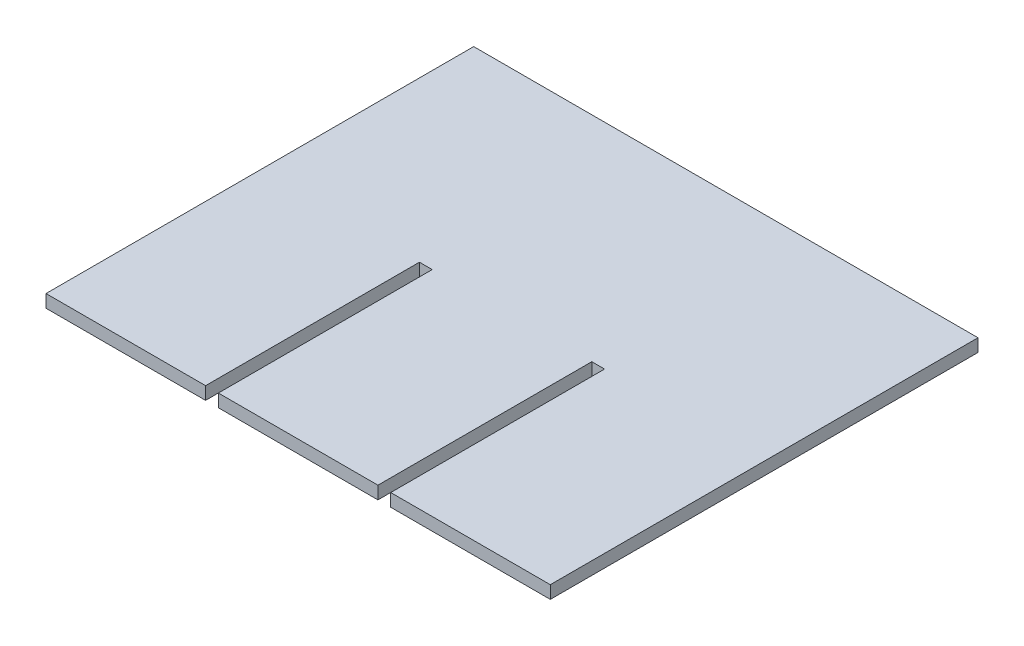
ISO-10303-21;
HEADER;
FILE_DESCRIPTION(('STEP AP214'),'2;1');
FILE_NAME('part.step','',(''),(''),'','','');
FILE_SCHEMA(('AUTOMOTIVE_DESIGN { 1 0 10303 214 1 1 1 1 }'));
ENDSEC;
DATA;
#1=APPLICATION_CONTEXT('core data for automotive mechanical design processes');
#2=APPLICATION_PROTOCOL_DEFINITION('international standard','automotive_design',2000,#1);
#3=PRODUCT_CONTEXT('',#1,'mechanical');
#4=PRODUCT('Part','Part','',(#3));
#5=PRODUCT_RELATED_PRODUCT_CATEGORY('part','',(#4));
#6=PRODUCT_DEFINITION_FORMATION('','',#4);
#7=PRODUCT_DEFINITION_CONTEXT('part definition',#1,'design');
#8=PRODUCT_DEFINITION('design','',#6,#7);
#9=PRODUCT_DEFINITION_SHAPE('','',#8);
#10=(LENGTH_UNIT() NAMED_UNIT(*) SI_UNIT(.MILLI.,.METRE.));
#11=(NAMED_UNIT(*) PLANE_ANGLE_UNIT() SI_UNIT($,.RADIAN.));
#12=(NAMED_UNIT(*) SI_UNIT($,.STERADIAN.) SOLID_ANGLE_UNIT());
#13=UNCERTAINTY_MEASURE_WITH_UNIT(LENGTH_MEASURE(1.E-05),#10,'distance_accuracy_value','');
#14=(GEOMETRIC_REPRESENTATION_CONTEXT(3) GLOBAL_UNCERTAINTY_ASSIGNED_CONTEXT((#13)) GLOBAL_UNIT_ASSIGNED_CONTEXT((#10,
#11,#12)) REPRESENTATION_CONTEXT('',''));
#15=CARTESIAN_POINT('',(0.,0.,0.));
#16=DIRECTION('',(0.,0.,1.));
#17=DIRECTION('',(1.,0.,0.));
#18=AXIS2_PLACEMENT_3D('',#15,#16,#17);
#19=CARTESIAN_POINT('',(39.5,2.,33.5));
#20=DIRECTION('',(0.,0.,-1.));
#21=DIRECTION('',(-1.,0.,0.));
#22=AXIS2_PLACEMENT_3D('',#19,#20,#21);
#23=PLANE('',#22);
#24=DIRECTION('',(0.,1.,0.));
#25=VECTOR('',#24,1.);
#26=CARTESIAN_POINT('',(-14.5,0.,33.5));
#27=LINE('',#26,#25);
#28=CARTESIAN_POINT('',(-14.5,0.,33.5));
#29=VERTEX_POINT('',#28);
#30=CARTESIAN_POINT('',(-14.5,2.,33.5));
#31=VERTEX_POINT('',#30);
#32=EDGE_CURVE('E237',#29,#31,#27,.T.);
#33=ORIENTED_EDGE('',*,*,#32,.T.);
#34=DIRECTION('',(1.,0.,0.));
#35=VECTOR('',#34,1.);
#36=CARTESIAN_POINT('',(39.5,2.,33.5));
#37=LINE('',#36,#35);
#38=CARTESIAN_POINT('',(-39.5,2.,33.5));
#39=VERTEX_POINT('',#38);
#40=EDGE_CURVE('E145',#39,#31,#37,.T.);
#41=ORIENTED_EDGE('',*,*,#40,.F.);
#42=DIRECTION('',(0.,-1.,0.));
#43=VECTOR('',#42,1.);
#44=CARTESIAN_POINT('',(-39.5,2.,33.5));
#45=LINE('',#44,#43);
#46=CARTESIAN_POINT('',(-39.5,0.,33.5));
#47=VERTEX_POINT('',#46);
#48=EDGE_CURVE('E11',#39,#47,#45,.T.);
#49=ORIENTED_EDGE('',*,*,#48,.T.);
#50=DIRECTION('',(1.,0.,0.));
#51=VECTOR('',#50,1.);
#52=CARTESIAN_POINT('',(39.5,0.,33.5));
#53=LINE('',#52,#51);
#54=EDGE_CURVE('E162',#47,#29,#53,.T.);
#55=ORIENTED_EDGE('',*,*,#54,.T.);
#56=EDGE_LOOP('',(#33,#41,#49,#55));
#57=FACE_BOUND('',#56,.T.);
#58=ADVANCED_FACE('F35',(#57),#23,.F.);
#59=DIRECTION('',(0.,1.,0.));
#60=VECTOR('',#59,1.);
#61=CARTESIAN_POINT('',(-12.5,0.,33.5));
#62=LINE('',#61,#60);
#63=CARTESIAN_POINT('',(-12.5,0.,33.5));
#64=VERTEX_POINT('',#63);
#65=CARTESIAN_POINT('',(-12.5,2.,33.5));
#66=VERTEX_POINT('',#65);
#67=EDGE_CURVE('E123',#64,#66,#62,.T.);
#68=ORIENTED_EDGE('',*,*,#67,.F.);
#69=CARTESIAN_POINT('',(12.5,0.,33.5));
#70=VERTEX_POINT('',#69);
#71=EDGE_CURVE('E58',#64,#70,#53,.T.);
#72=ORIENTED_EDGE('',*,*,#71,.T.);
#73=DIRECTION('',(0.,1.,0.));
#74=VECTOR('',#73,1.);
#75=CARTESIAN_POINT('',(12.5,0.,33.5));
#76=LINE('',#75,#74);
#77=CARTESIAN_POINT('',(12.5,2.,33.5));
#78=VERTEX_POINT('',#77);
#79=EDGE_CURVE('E144',#70,#78,#76,.T.);
#80=ORIENTED_EDGE('',*,*,#79,.T.);
#81=EDGE_CURVE('E136',#66,#78,#37,.T.);
#82=ORIENTED_EDGE('',*,*,#81,.F.);
#83=EDGE_LOOP('',(#68,#72,#80,#82));
#84=FACE_BOUND('',#83,.T.);
#85=ADVANCED_FACE('F143',(#84),#23,.F.);
#86=CARTESIAN_POINT('',(0.,2.,0.));
#87=DIRECTION('',(0.,1.,0.));
#88=DIRECTION('',(0.,0.,1.));
#89=AXIS2_PLACEMENT_3D('',#86,#87,#88);
#90=PLANE('',#89);
#91=ORIENTED_EDGE('',*,*,#40,.T.);
#92=DIRECTION('',(0.,0.,-1.));
#93=VECTOR('',#92,1.);
#94=CARTESIAN_POINT('',(-14.5,2.,33.5));
#95=LINE('',#94,#93);
#96=CARTESIAN_POINT('',(-14.5,2.,0.));
#97=VERTEX_POINT('',#96);
#98=EDGE_CURVE('E225',#31,#97,#95,.T.);
#99=ORIENTED_EDGE('',*,*,#98,.T.);
#100=DIRECTION('',(1.,0.,0.));
#101=VECTOR('',#100,1.);
#102=CARTESIAN_POINT('',(-14.5,2.,0.));
#103=LINE('',#102,#101);
#104=CARTESIAN_POINT('',(-12.5,2.,0.));
#105=VERTEX_POINT('',#104);
#106=EDGE_CURVE('E140',#97,#105,#103,.T.);
#107=ORIENTED_EDGE('',*,*,#106,.T.);
#108=DIRECTION('',(0.,0.,1.));
#109=VECTOR('',#108,1.);
#110=CARTESIAN_POINT('',(-12.5,2.,0.));
#111=LINE('',#110,#109);
#112=EDGE_CURVE('E126',#105,#66,#111,.T.);
#113=ORIENTED_EDGE('',*,*,#112,.T.);
#114=ORIENTED_EDGE('',*,*,#81,.T.);
#115=DIRECTION('',(0.,0.,1.));
#116=VECTOR('',#115,1.);
#117=CARTESIAN_POINT('',(12.5,2.,0.));
#118=LINE('',#117,#116);
#119=CARTESIAN_POINT('',(12.5,2.,0.));
#120=VERTEX_POINT('',#119);
#121=EDGE_CURVE('E224',#120,#78,#118,.T.);
#122=ORIENTED_EDGE('',*,*,#121,.F.);
#123=DIRECTION('',(-1.,0.,0.));
#124=VECTOR('',#123,1.);
#125=CARTESIAN_POINT('',(14.5,2.,0.));
#126=LINE('',#125,#124);
#127=CARTESIAN_POINT('',(14.5,2.,0.));
#128=VERTEX_POINT('',#127);
#129=EDGE_CURVE('E222',#128,#120,#126,.T.);
#130=ORIENTED_EDGE('',*,*,#129,.F.);
#131=DIRECTION('',(0.,0.,-1.));
#132=VECTOR('',#131,1.);
#133=CARTESIAN_POINT('',(14.5,2.,33.5));
#134=LINE('',#133,#132);
#135=CARTESIAN_POINT('',(14.5,2.,33.5));
#136=VERTEX_POINT('',#135);
#137=EDGE_CURVE('E200',#136,#128,#134,.T.);
#138=ORIENTED_EDGE('',*,*,#137,.F.);
#139=CARTESIAN_POINT('',(39.5,2.,33.5));
#140=VERTEX_POINT('',#139);
#141=EDGE_CURVE('E146',#136,#140,#37,.T.);
#142=ORIENTED_EDGE('',*,*,#141,.T.);
#143=DIRECTION('',(0.,0.,-1.));
#144=VECTOR('',#143,1.);
#145=CARTESIAN_POINT('',(39.5,2.,33.5));
#146=LINE('',#145,#144);
#147=CARTESIAN_POINT('',(39.5,2.,-33.5));
#148=VERTEX_POINT('',#147);
#149=EDGE_CURVE('E148',#140,#148,#146,.T.);
#150=ORIENTED_EDGE('',*,*,#149,.T.);
#151=DIRECTION('',(-1.,0.,0.));
#152=VECTOR('',#151,1.);
#153=CARTESIAN_POINT('',(39.5,2.,-33.5));
#154=LINE('',#153,#152);
#155=CARTESIAN_POINT('',(-39.5,2.,-33.5));
#156=VERTEX_POINT('',#155);
#157=EDGE_CURVE('E154',#148,#156,#154,.T.);
#158=ORIENTED_EDGE('',*,*,#157,.T.);
#159=DIRECTION('',(0.,0.,1.));
#160=VECTOR('',#159,1.);
#161=CARTESIAN_POINT('',(-39.5,2.,33.5));
#162=LINE('',#161,#160);
#163=EDGE_CURVE('E149',#156,#39,#162,.T.);
#164=ORIENTED_EDGE('',*,*,#163,.T.);
#165=EDGE_LOOP('',(#91,#99,#107,#113,#114,#122,#130,#138,#142,#150,#158,#164));
#166=FACE_BOUND('',#165,.T.);
#167=ADVANCED_FACE('F134',(#166),#90,.T.);
#168=CARTESIAN_POINT('',(0.,0.,0.));
#169=DIRECTION('',(0.,1.,0.));
#170=DIRECTION('',(0.,0.,1.));
#171=AXIS2_PLACEMENT_3D('',#168,#169,#170);
#172=PLANE('',#171);
#173=DIRECTION('',(0.,0.,-1.));
#174=VECTOR('',#173,1.);
#175=CARTESIAN_POINT('',(-14.5,0.,33.5));
#176=LINE('',#175,#174);
#177=CARTESIAN_POINT('',(-14.5,0.,0.));
#178=VERTEX_POINT('',#177);
#179=EDGE_CURVE('E141',#29,#178,#176,.T.);
#180=ORIENTED_EDGE('',*,*,#179,.F.);
#181=ORIENTED_EDGE('',*,*,#54,.F.);
#182=DIRECTION('',(0.,0.,1.));
#183=VECTOR('',#182,1.);
#184=CARTESIAN_POINT('',(-39.5,0.,33.5));
#185=LINE('',#184,#183);
#186=CARTESIAN_POINT('',(-39.5,0.,-33.5));
#187=VERTEX_POINT('',#186);
#188=EDGE_CURVE('E157',#187,#47,#185,.T.);
#189=ORIENTED_EDGE('',*,*,#188,.F.);
#190=DIRECTION('',(-1.,0.,0.));
#191=VECTOR('',#190,1.);
#192=CARTESIAN_POINT('',(39.5,0.,-33.5));
#193=LINE('',#192,#191);
#194=CARTESIAN_POINT('',(39.5,0.,-33.5));
#195=VERTEX_POINT('',#194);
#196=EDGE_CURVE('E167',#195,#187,#193,.T.);
#197=ORIENTED_EDGE('',*,*,#196,.F.);
#198=DIRECTION('',(0.,0.,-1.));
#199=VECTOR('',#198,1.);
#200=CARTESIAN_POINT('',(39.5,0.,33.5));
#201=LINE('',#200,#199);
#202=CARTESIAN_POINT('',(39.5,0.,33.5));
#203=VERTEX_POINT('',#202);
#204=EDGE_CURVE('E165',#203,#195,#201,.T.);
#205=ORIENTED_EDGE('',*,*,#204,.F.);
#206=CARTESIAN_POINT('',(14.5,0.,33.5));
#207=VERTEX_POINT('',#206);
#208=EDGE_CURVE('E160',#207,#203,#53,.T.);
#209=ORIENTED_EDGE('',*,*,#208,.F.);
#210=DIRECTION('',(0.,0.,-1.));
#211=VECTOR('',#210,1.);
#212=CARTESIAN_POINT('',(14.5,0.,33.5));
#213=LINE('',#212,#211);
#214=CARTESIAN_POINT('',(14.5,0.,0.));
#215=VERTEX_POINT('',#214);
#216=EDGE_CURVE('E210',#207,#215,#213,.T.);
#217=ORIENTED_EDGE('',*,*,#216,.T.);
#218=DIRECTION('',(-1.,0.,0.));
#219=VECTOR('',#218,1.);
#220=CARTESIAN_POINT('',(14.5,0.,0.));
#221=LINE('',#220,#219);
#222=CARTESIAN_POINT('',(12.5,0.,0.));
#223=VERTEX_POINT('',#222);
#224=EDGE_CURVE('E218',#215,#223,#221,.T.);
#225=ORIENTED_EDGE('',*,*,#224,.T.);
#226=DIRECTION('',(0.,0.,1.));
#227=VECTOR('',#226,1.);
#228=CARTESIAN_POINT('',(12.5,0.,0.));
#229=LINE('',#228,#227);
#230=EDGE_CURVE('E214',#223,#70,#229,.T.);
#231=ORIENTED_EDGE('',*,*,#230,.T.);
#232=ORIENTED_EDGE('',*,*,#71,.F.);
#233=DIRECTION('',(0.,0.,1.));
#234=VECTOR('',#233,1.);
#235=CARTESIAN_POINT('',(-12.5,0.,0.));
#236=LINE('',#235,#234);
#237=CARTESIAN_POINT('',(-12.5,0.,0.));
#238=VERTEX_POINT('',#237);
#239=EDGE_CURVE('E129',#238,#64,#236,.T.);
#240=ORIENTED_EDGE('',*,*,#239,.F.);
#241=DIRECTION('',(1.,0.,0.));
#242=VECTOR('',#241,1.);
#243=CARTESIAN_POINT('',(-14.5,0.,0.));
#244=LINE('',#243,#242);
#245=EDGE_CURVE('E229',#178,#238,#244,.T.);
#246=ORIENTED_EDGE('',*,*,#245,.F.);
#247=EDGE_LOOP('',(#180,#181,#189,#197,#205,#209,#217,#225,#231,#232,#240,#246));
#248=FACE_BOUND('',#247,.T.);
#249=ADVANCED_FACE('F186',(#248),#172,.F.);
#250=ORIENTED_EDGE('',*,*,#141,.F.);
#251=DIRECTION('',(0.,1.,0.));
#252=VECTOR('',#251,1.);
#253=CARTESIAN_POINT('',(14.5,0.,33.5));
#254=LINE('',#253,#252);
#255=EDGE_CURVE('E203',#207,#136,#254,.T.);
#256=ORIENTED_EDGE('',*,*,#255,.F.);
#257=ORIENTED_EDGE('',*,*,#208,.T.);
#258=DIRECTION('',(0.,-1.,0.));
#259=VECTOR('',#258,1.);
#260=CARTESIAN_POINT('',(39.5,2.,33.5));
#261=LINE('',#260,#259);
#262=EDGE_CURVE('E43',#140,#203,#261,.T.);
#263=ORIENTED_EDGE('',*,*,#262,.F.);
#264=EDGE_LOOP('',(#250,#256,#257,#263));
#265=FACE_BOUND('',#264,.T.);
#266=ADVANCED_FACE('F202',(#265),#23,.F.);
#267=CARTESIAN_POINT('',(-39.5,2.,33.5));
#268=DIRECTION('',(1.,0.,0.));
#269=DIRECTION('',(0.,0.,-1.));
#270=AXIS2_PLACEMENT_3D('',#267,#268,#269);
#271=PLANE('',#270);
#272=ORIENTED_EDGE('',*,*,#188,.T.);
#273=ORIENTED_EDGE('',*,*,#48,.F.);
#274=ORIENTED_EDGE('',*,*,#163,.F.);
#275=DIRECTION('',(0.,-1.,0.));
#276=VECTOR('',#275,1.);
#277=CARTESIAN_POINT('',(-39.5,2.,-33.5));
#278=LINE('',#277,#276);
#279=EDGE_CURVE('E156',#156,#187,#278,.T.);
#280=ORIENTED_EDGE('',*,*,#279,.T.);
#281=EDGE_LOOP('',(#272,#273,#274,#280));
#282=FACE_BOUND('',#281,.T.);
#283=ADVANCED_FACE('F37',(#282),#271,.F.);
#284=CARTESIAN_POINT('',(39.5,2.,33.5));
#285=DIRECTION('',(-1.,0.,0.));
#286=DIRECTION('',(0.,0.,1.));
#287=AXIS2_PLACEMENT_3D('',#284,#285,#286);
#288=PLANE('',#287);
#289=ORIENTED_EDGE('',*,*,#204,.T.);
#290=DIRECTION('',(0.,-1.,0.));
#291=VECTOR('',#290,1.);
#292=CARTESIAN_POINT('',(39.5,2.,-33.5));
#293=LINE('',#292,#291);
#294=EDGE_CURVE('E171',#148,#195,#293,.T.);
#295=ORIENTED_EDGE('',*,*,#294,.F.);
#296=ORIENTED_EDGE('',*,*,#149,.F.);
#297=ORIENTED_EDGE('',*,*,#262,.T.);
#298=EDGE_LOOP('',(#289,#295,#296,#297));
#299=FACE_BOUND('',#298,.T.);
#300=ADVANCED_FACE('F178',(#299),#288,.F.);
#301=CARTESIAN_POINT('',(39.5,2.,-33.5));
#302=DIRECTION('',(0.,0.,1.));
#303=DIRECTION('',(1.,0.,0.));
#304=AXIS2_PLACEMENT_3D('',#301,#302,#303);
#305=PLANE('',#304);
#306=ORIENTED_EDGE('',*,*,#196,.T.);
#307=ORIENTED_EDGE('',*,*,#279,.F.);
#308=ORIENTED_EDGE('',*,*,#157,.F.);
#309=ORIENTED_EDGE('',*,*,#294,.T.);
#310=EDGE_LOOP('',(#306,#307,#308,#309));
#311=FACE_BOUND('',#310,.T.);
#312=ADVANCED_FACE('F191',(#311),#305,.F.);
#313=CARTESIAN_POINT('',(14.5,0.,0.));
#314=DIRECTION('',(0.,0.,-1.));
#315=DIRECTION('',(-1.,0.,0.));
#316=AXIS2_PLACEMENT_3D('',#313,#314,#315);
#317=PLANE('',#316);
#318=ORIENTED_EDGE('',*,*,#129,.T.);
#319=DIRECTION('',(0.,1.,0.));
#320=VECTOR('',#319,1.);
#321=CARTESIAN_POINT('',(12.5,0.,0.));
#322=LINE('',#321,#320);
#323=EDGE_CURVE('E207',#223,#120,#322,.T.);
#324=ORIENTED_EDGE('',*,*,#323,.F.);
#325=ORIENTED_EDGE('',*,*,#224,.F.);
#326=DIRECTION('',(0.,1.,0.));
#327=VECTOR('',#326,1.);
#328=CARTESIAN_POINT('',(14.5,0.,0.));
#329=LINE('',#328,#327);
#330=EDGE_CURVE('E161',#215,#128,#329,.T.);
#331=ORIENTED_EDGE('',*,*,#330,.T.);
#332=EDGE_LOOP('',(#318,#324,#325,#331));
#333=FACE_BOUND('',#332,.T.);
#334=ADVANCED_FACE('F273',(#333),#317,.F.);
#335=CARTESIAN_POINT('',(14.5,0.,33.5));
#336=DIRECTION('',(1.,0.,0.));
#337=DIRECTION('',(0.,0.,-1.));
#338=AXIS2_PLACEMENT_3D('',#335,#336,#337);
#339=PLANE('',#338);
#340=ORIENTED_EDGE('',*,*,#137,.T.);
#341=ORIENTED_EDGE('',*,*,#330,.F.);
#342=ORIENTED_EDGE('',*,*,#216,.F.);
#343=ORIENTED_EDGE('',*,*,#255,.T.);
#344=EDGE_LOOP('',(#340,#341,#342,#343));
#345=FACE_BOUND('',#344,.T.);
#346=ADVANCED_FACE('F289',(#345),#339,.F.);
#347=CARTESIAN_POINT('',(12.5,0.,0.));
#348=DIRECTION('',(-1.,0.,0.));
#349=DIRECTION('',(0.,0.,1.));
#350=AXIS2_PLACEMENT_3D('',#347,#348,#349);
#351=PLANE('',#350);
#352=ORIENTED_EDGE('',*,*,#121,.T.);
#353=ORIENTED_EDGE('',*,*,#79,.F.);
#354=ORIENTED_EDGE('',*,*,#230,.F.);
#355=ORIENTED_EDGE('',*,*,#323,.T.);
#356=EDGE_LOOP('',(#352,#353,#354,#355));
#357=FACE_BOUND('',#356,.T.);
#358=ADVANCED_FACE('F253',(#357),#351,.F.);
#359=CARTESIAN_POINT('',(-14.5,0.,33.5));
#360=DIRECTION('',(1.,0.,0.));
#361=DIRECTION('',(0.,0.,-1.));
#362=AXIS2_PLACEMENT_3D('',#359,#360,#361);
#363=PLANE('',#362);
#364=ORIENTED_EDGE('',*,*,#98,.F.);
#365=ORIENTED_EDGE('',*,*,#32,.F.);
#366=ORIENTED_EDGE('',*,*,#179,.T.);
#367=DIRECTION('',(0.,1.,0.));
#368=VECTOR('',#367,1.);
#369=CARTESIAN_POINT('',(-14.5,0.,0.));
#370=LINE('',#369,#368);
#371=EDGE_CURVE('E235',#178,#97,#370,.T.);
#372=ORIENTED_EDGE('',*,*,#371,.T.);
#373=EDGE_LOOP('',(#364,#365,#366,#372));
#374=FACE_BOUND('',#373,.T.);
#375=ADVANCED_FACE('F241',(#374),#363,.T.);
#376=CARTESIAN_POINT('',(-14.5,0.,0.));
#377=DIRECTION('',(0.,0.,1.));
#378=DIRECTION('',(1.,0.,0.));
#379=AXIS2_PLACEMENT_3D('',#376,#377,#378);
#380=PLANE('',#379);
#381=ORIENTED_EDGE('',*,*,#106,.F.);
#382=ORIENTED_EDGE('',*,*,#371,.F.);
#383=ORIENTED_EDGE('',*,*,#245,.T.);
#384=DIRECTION('',(0.,1.,0.));
#385=VECTOR('',#384,1.);
#386=CARTESIAN_POINT('',(-12.5,0.,0.));
#387=LINE('',#386,#385);
#388=EDGE_CURVE('E50',#238,#105,#387,.T.);
#389=ORIENTED_EDGE('',*,*,#388,.T.);
#390=EDGE_LOOP('',(#381,#382,#383,#389));
#391=FACE_BOUND('',#390,.T.);
#392=ADVANCED_FACE('F245',(#391),#380,.T.);
#393=CARTESIAN_POINT('',(-12.5,0.,0.));
#394=DIRECTION('',(-1.,0.,0.));
#395=DIRECTION('',(0.,0.,1.));
#396=AXIS2_PLACEMENT_3D('',#393,#394,#395);
#397=PLANE('',#396);
#398=ORIENTED_EDGE('',*,*,#112,.F.);
#399=ORIENTED_EDGE('',*,*,#388,.F.);
#400=ORIENTED_EDGE('',*,*,#239,.T.);
#401=ORIENTED_EDGE('',*,*,#67,.T.);
#402=EDGE_LOOP('',(#398,#399,#400,#401));
#403=FACE_BOUND('',#402,.T.);
#404=ADVANCED_FACE('F125',(#403),#397,.T.);
#405=CLOSED_SHELL('',(#58,#85,#167,#249,#266,#283,#300,#312,#334,#346,#358,#375,#392,#404));
#406=MANIFOLD_SOLID_BREP('B2',#405);
#407=ADVANCED_BREP_SHAPE_REPRESENTATION('',(#18,#406),#14);
#408=SHAPE_DEFINITION_REPRESENTATION(#9,#407);
ENDSEC;
END-ISO-10303-21;
